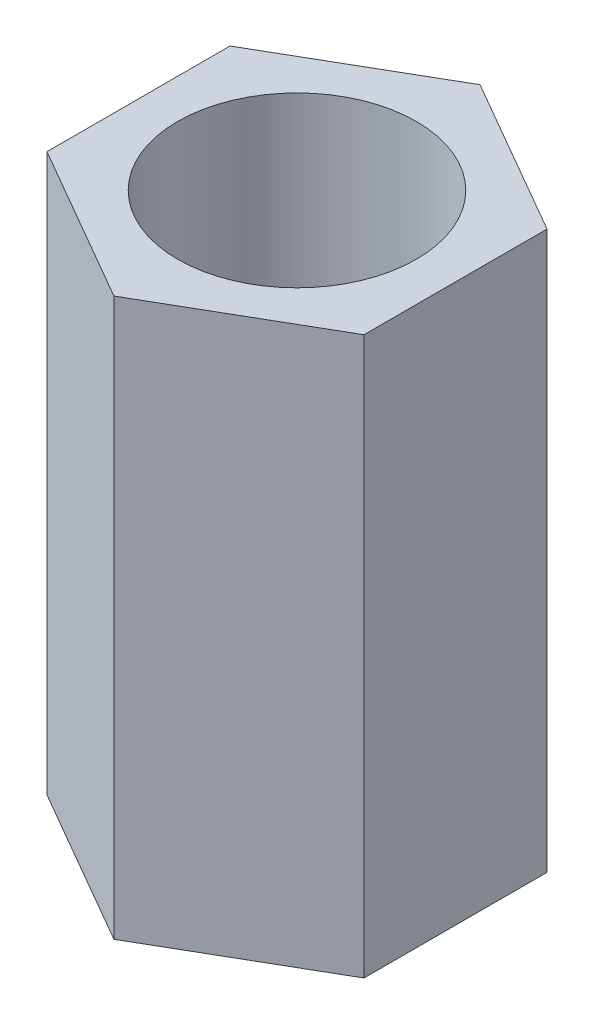
ISO-10303-21;
HEADER;
FILE_DESCRIPTION(('STEP AP214'),'2;1');
FILE_NAME('part.step','',(''),(''),'','','');
FILE_SCHEMA(('AUTOMOTIVE_DESIGN { 1 0 10303 214 1 1 1 1 }'));
ENDSEC;
DATA;
#1=APPLICATION_CONTEXT('core data for automotive mechanical design processes');
#2=APPLICATION_PROTOCOL_DEFINITION('international standard','automotive_design',2000,#1);
#3=PRODUCT_CONTEXT('',#1,'mechanical');
#4=PRODUCT('Part','Part','',(#3));
#5=PRODUCT_RELATED_PRODUCT_CATEGORY('part','',(#4));
#6=PRODUCT_DEFINITION_FORMATION('','',#4);
#7=PRODUCT_DEFINITION_CONTEXT('part definition',#1,'design');
#8=PRODUCT_DEFINITION('design','',#6,#7);
#9=PRODUCT_DEFINITION_SHAPE('','',#8);
#10=(LENGTH_UNIT() NAMED_UNIT(*) SI_UNIT(.MILLI.,.METRE.));
#11=(NAMED_UNIT(*) PLANE_ANGLE_UNIT() SI_UNIT($,.RADIAN.));
#12=(NAMED_UNIT(*) SI_UNIT($,.STERADIAN.) SOLID_ANGLE_UNIT());
#13=UNCERTAINTY_MEASURE_WITH_UNIT(LENGTH_MEASURE(1.E-05),#10,'distance_accuracy_value','');
#14=(GEOMETRIC_REPRESENTATION_CONTEXT(3) GLOBAL_UNCERTAINTY_ASSIGNED_CONTEXT((#13)) GLOBAL_UNIT_ASSIGNED_CONTEXT((#10,
#11,#12)) REPRESENTATION_CONTEXT('',''));
#15=CARTESIAN_POINT('',(0.,0.,0.));
#16=DIRECTION('',(0.,0.,1.));
#17=DIRECTION('',(1.,0.,0.));
#18=AXIS2_PLACEMENT_3D('',#15,#16,#17);
#19=CARTESIAN_POINT('',(0.,7.,0.));
#20=DIRECTION('',(0.,1.,0.));
#21=DIRECTION('',(0.,0.,1.));
#22=AXIS2_PLACEMENT_3D('',#19,#20,#21);
#23=PLANE('',#22);
#24=DIRECTION('',(0.,0.,-1.));
#25=VECTOR('',#24,1.);
#26=CARTESIAN_POINT('',(1.99185842870422,7.,1.14999999999998));
#27=LINE('',#26,#25);
#28=CARTESIAN_POINT('',(1.99185842870422,7.,1.14999999999998));
#29=VERTEX_POINT('',#28);
#30=CARTESIAN_POINT('',(1.9918584287042,7.,-1.15000000000002));
#31=VERTEX_POINT('',#30);
#32=EDGE_CURVE('E137',#29,#31,#27,.T.);
#33=ORIENTED_EDGE('',*,*,#32,.T.);
#34=DIRECTION('',(-0.866025403784443,0.,-0.499999999999992));
#35=VECTOR('',#34,1.);
#36=CARTESIAN_POINT('',(1.9918584287042,7.,-1.15000000000002));
#37=LINE('',#36,#35);
#38=CARTESIAN_POINT('',(0.,7.,-2.3));
#39=VERTEX_POINT('',#38);
#40=EDGE_CURVE('E95',#31,#39,#37,.T.);
#41=ORIENTED_EDGE('',*,*,#40,.T.);
#42=DIRECTION('',(-0.866025403784434,0.,0.500000000000008));
#43=VECTOR('',#42,1.);
#44=CARTESIAN_POINT('',(0.,7.,-2.3));
#45=LINE('',#44,#43);
#46=CARTESIAN_POINT('',(-1.99185842870422,7.,-1.14999999999998));
#47=VERTEX_POINT('',#46);
#48=EDGE_CURVE('E108',#39,#47,#45,.T.);
#49=ORIENTED_EDGE('',*,*,#48,.T.);
#50=DIRECTION('',(0.,0.,1.));
#51=VECTOR('',#50,1.);
#52=CARTESIAN_POINT('',(-1.99185842870422,7.,-1.14999999999998));
#53=LINE('',#52,#51);
#54=CARTESIAN_POINT('',(-1.9918584287042,7.,1.15000000000002));
#55=VERTEX_POINT('',#54);
#56=EDGE_CURVE('E102',#47,#55,#53,.T.);
#57=ORIENTED_EDGE('',*,*,#56,.T.);
#58=DIRECTION('',(0.866025403784443,0.,0.499999999999992));
#59=VECTOR('',#58,1.);
#60=CARTESIAN_POINT('',(-1.9918584287042,7.,1.15000000000002));
#61=LINE('',#60,#59);
#62=CARTESIAN_POINT('',(0.,7.,2.3));
#63=VERTEX_POINT('',#62);
#64=EDGE_CURVE('E106',#55,#63,#61,.T.);
#65=ORIENTED_EDGE('',*,*,#64,.T.);
#66=DIRECTION('',(0.866025403784434,0.,-0.500000000000008));
#67=VECTOR('',#66,1.);
#68=CARTESIAN_POINT('',(0.,7.,2.3));
#69=LINE('',#68,#67);
#70=EDGE_CURVE('E58',#63,#29,#69,.T.);
#71=ORIENTED_EDGE('',*,*,#70,.T.);
#72=EDGE_LOOP('',(#33,#41,#49,#57,#65,#71));
#73=FACE_BOUND('',#72,.T.);
#74=CARTESIAN_POINT('',(0.,7.,0.));
#75=DIRECTION('',(0.,1.,0.));
#76=DIRECTION('',(0.,0.,1.));
#77=AXIS2_PLACEMENT_3D('',#74,#75,#76);
#78=CIRCLE('',#77,1.5);
#79=CARTESIAN_POINT('',(0.,7.,1.5));
#80=VERTEX_POINT('',#79);
#81=EDGE_CURVE('E130',#80,#80,#78,.T.);
#82=ORIENTED_EDGE('',*,*,#81,.F.);
#83=EDGE_LOOP('',(#82));
#84=FACE_BOUND('',#83,.T.);
#85=ADVANCED_FACE('F41',(#73,#84),#23,.T.);
#86=CARTESIAN_POINT('',(0.,0.,0.));
#87=DIRECTION('',(0.,1.,0.));
#88=DIRECTION('',(0.,0.,1.));
#89=AXIS2_PLACEMENT_3D('',#86,#87,#88);
#90=PLANE('',#89);
#91=DIRECTION('',(0.,0.,-1.));
#92=VECTOR('',#91,1.);
#93=CARTESIAN_POINT('',(1.99185842870422,0.,1.14999999999998));
#94=LINE('',#93,#92);
#95=CARTESIAN_POINT('',(1.99185842870422,0.,1.14999999999998));
#96=VERTEX_POINT('',#95);
#97=CARTESIAN_POINT('',(1.9918584287042,0.,-1.15000000000002));
#98=VERTEX_POINT('',#97);
#99=EDGE_CURVE('E126',#96,#98,#94,.T.);
#100=ORIENTED_EDGE('',*,*,#99,.F.);
#101=DIRECTION('',(0.866025403784434,0.,-0.500000000000008));
#102=VECTOR('',#101,1.);
#103=CARTESIAN_POINT('',(0.,0.,2.3));
#104=LINE('',#103,#102);
#105=CARTESIAN_POINT('',(0.,0.,2.3));
#106=VERTEX_POINT('',#105);
#107=EDGE_CURVE('E87',#106,#96,#104,.T.);
#108=ORIENTED_EDGE('',*,*,#107,.F.);
#109=DIRECTION('',(0.866025403784443,0.,0.499999999999992));
#110=VECTOR('',#109,1.);
#111=CARTESIAN_POINT('',(-1.9918584287042,0.,1.15000000000002));
#112=LINE('',#111,#110);
#113=CARTESIAN_POINT('',(-1.9918584287042,0.,1.15000000000002));
#114=VERTEX_POINT('',#113);
#115=EDGE_CURVE('E81',#114,#106,#112,.T.);
#116=ORIENTED_EDGE('',*,*,#115,.F.);
#117=DIRECTION('',(0.,0.,1.));
#118=VECTOR('',#117,1.);
#119=CARTESIAN_POINT('',(-1.99185842870422,0.,-1.14999999999998));
#120=LINE('',#119,#118);
#121=CARTESIAN_POINT('',(-1.99185842870422,0.,-1.14999999999998));
#122=VERTEX_POINT('',#121);
#123=EDGE_CURVE('E116',#122,#114,#120,.T.);
#124=ORIENTED_EDGE('',*,*,#123,.F.);
#125=DIRECTION('',(-0.866025403784434,0.,0.500000000000008));
#126=VECTOR('',#125,1.);
#127=CARTESIAN_POINT('',(0.,0.,-2.3));
#128=LINE('',#127,#126);
#129=CARTESIAN_POINT('',(0.,0.,-2.3));
#130=VERTEX_POINT('',#129);
#131=EDGE_CURVE('E132',#130,#122,#128,.T.);
#132=ORIENTED_EDGE('',*,*,#131,.F.);
#133=DIRECTION('',(-0.866025403784443,0.,-0.499999999999992));
#134=VECTOR('',#133,1.);
#135=CARTESIAN_POINT('',(1.9918584287042,0.,-1.15000000000002));
#136=LINE('',#135,#134);
#137=EDGE_CURVE('E129',#98,#130,#136,.T.);
#138=ORIENTED_EDGE('',*,*,#137,.F.);
#139=EDGE_LOOP('',(#100,#108,#116,#124,#132,#138));
#140=FACE_BOUND('',#139,.T.);
#141=CARTESIAN_POINT('',(0.,0.,0.));
#142=DIRECTION('',(0.,1.,0.));
#143=DIRECTION('',(0.,0.,1.));
#144=AXIS2_PLACEMENT_3D('',#141,#142,#143);
#145=CIRCLE('',#144,1.5);
#146=CARTESIAN_POINT('',(0.,0.,1.5));
#147=VERTEX_POINT('',#146);
#148=EDGE_CURVE('E230',#147,#147,#145,.T.);
#149=ORIENTED_EDGE('',*,*,#148,.T.);
#150=EDGE_LOOP('',(#149));
#151=FACE_BOUND('',#150,.T.);
#152=ADVANCED_FACE('F146',(#140,#151),#90,.F.);
#153=CARTESIAN_POINT('',(1.99185842870422,7.,1.14999999999998));
#154=DIRECTION('',(-1.,0.,0.));
#155=DIRECTION('',(0.,0.,1.));
#156=AXIS2_PLACEMENT_3D('',#153,#154,#155);
#157=PLANE('',#156);
#158=ORIENTED_EDGE('',*,*,#99,.T.);
#159=DIRECTION('',(0.,-1.,0.));
#160=VECTOR('',#159,1.);
#161=CARTESIAN_POINT('',(1.9918584287042,7.,-1.15000000000002));
#162=LINE('',#161,#160);
#163=EDGE_CURVE('E11',#31,#98,#162,.T.);
#164=ORIENTED_EDGE('',*,*,#163,.F.);
#165=ORIENTED_EDGE('',*,*,#32,.F.);
#166=DIRECTION('',(0.,-1.,0.));
#167=VECTOR('',#166,1.);
#168=CARTESIAN_POINT('',(1.99185842870422,7.,1.14999999999998));
#169=LINE('',#168,#167);
#170=EDGE_CURVE('E122',#29,#96,#169,.T.);
#171=ORIENTED_EDGE('',*,*,#170,.T.);
#172=EDGE_LOOP('',(#158,#164,#165,#171));
#173=FACE_BOUND('',#172,.T.);
#174=ADVANCED_FACE('F43',(#173),#157,.F.);
#175=CARTESIAN_POINT('',(1.9918584287042,7.,-1.15000000000002));
#176=DIRECTION('',(-0.499999999999992,0.,0.866025403784443));
#177=DIRECTION('',(0.866025403784443,0.,0.499999999999992));
#178=AXIS2_PLACEMENT_3D('',#175,#176,#177);
#179=PLANE('',#178);
#180=ORIENTED_EDGE('',*,*,#137,.T.);
#181=DIRECTION('',(0.,-1.,0.));
#182=VECTOR('',#181,1.);
#183=CARTESIAN_POINT('',(0.,7.,-2.3));
#184=LINE('',#183,#182);
#185=EDGE_CURVE('E50',#39,#130,#184,.T.);
#186=ORIENTED_EDGE('',*,*,#185,.F.);
#187=ORIENTED_EDGE('',*,*,#40,.F.);
#188=ORIENTED_EDGE('',*,*,#163,.T.);
#189=EDGE_LOOP('',(#180,#186,#187,#188));
#190=FACE_BOUND('',#189,.T.);
#191=ADVANCED_FACE('F171',(#190),#179,.F.);
#192=CARTESIAN_POINT('',(0.,7.,-2.3));
#193=DIRECTION('',(0.500000000000008,0.,0.866025403784434));
#194=DIRECTION('',(0.866025403784434,0.,-0.500000000000008));
#195=AXIS2_PLACEMENT_3D('',#192,#193,#194);
#196=PLANE('',#195);
#197=ORIENTED_EDGE('',*,*,#131,.T.);
#198=DIRECTION('',(0.,-1.,0.));
#199=VECTOR('',#198,1.);
#200=CARTESIAN_POINT('',(-1.99185842870422,7.,-1.14999999999998));
#201=LINE('',#200,#199);
#202=EDGE_CURVE('E117',#47,#122,#201,.T.);
#203=ORIENTED_EDGE('',*,*,#202,.F.);
#204=ORIENTED_EDGE('',*,*,#48,.F.);
#205=ORIENTED_EDGE('',*,*,#185,.T.);
#206=EDGE_LOOP('',(#197,#203,#204,#205));
#207=FACE_BOUND('',#206,.T.);
#208=ADVANCED_FACE('F143',(#207),#196,.F.);
#209=CARTESIAN_POINT('',(-1.99185842870422,7.,-1.14999999999998));
#210=DIRECTION('',(1.,0.,0.));
#211=DIRECTION('',(0.,0.,-1.));
#212=AXIS2_PLACEMENT_3D('',#209,#210,#211);
#213=PLANE('',#212);
#214=ORIENTED_EDGE('',*,*,#123,.T.);
#215=DIRECTION('',(0.,-1.,0.));
#216=VECTOR('',#215,1.);
#217=CARTESIAN_POINT('',(-1.9918584287042,7.,1.15000000000002));
#218=LINE('',#217,#216);
#219=EDGE_CURVE('E113',#55,#114,#218,.T.);
#220=ORIENTED_EDGE('',*,*,#219,.F.);
#221=ORIENTED_EDGE('',*,*,#56,.F.);
#222=ORIENTED_EDGE('',*,*,#202,.T.);
#223=EDGE_LOOP('',(#214,#220,#221,#222));
#224=FACE_BOUND('',#223,.T.);
#225=ADVANCED_FACE('F114',(#224),#213,.F.);
#226=CARTESIAN_POINT('',(-1.9918584287042,7.,1.15000000000002));
#227=DIRECTION('',(0.499999999999992,0.,-0.866025403784443));
#228=DIRECTION('',(-0.866025403784443,0.,-0.499999999999992));
#229=AXIS2_PLACEMENT_3D('',#226,#227,#228);
#230=PLANE('',#229);
#231=ORIENTED_EDGE('',*,*,#115,.T.);
#232=DIRECTION('',(0.,-1.,0.));
#233=VECTOR('',#232,1.);
#234=CARTESIAN_POINT('',(0.,7.,2.3));
#235=LINE('',#234,#233);
#236=EDGE_CURVE('E118',#63,#106,#235,.T.);
#237=ORIENTED_EDGE('',*,*,#236,.F.);
#238=ORIENTED_EDGE('',*,*,#64,.F.);
#239=ORIENTED_EDGE('',*,*,#219,.T.);
#240=EDGE_LOOP('',(#231,#237,#238,#239));
#241=FACE_BOUND('',#240,.T.);
#242=ADVANCED_FACE('F120',(#241),#230,.F.);
#243=CARTESIAN_POINT('',(0.,7.,2.3));
#244=DIRECTION('',(-0.500000000000008,0.,-0.866025403784434));
#245=DIRECTION('',(-0.866025403784434,0.,0.500000000000008));
#246=AXIS2_PLACEMENT_3D('',#243,#244,#245);
#247=PLANE('',#246);
#248=ORIENTED_EDGE('',*,*,#107,.T.);
#249=ORIENTED_EDGE('',*,*,#170,.F.);
#250=ORIENTED_EDGE('',*,*,#70,.F.);
#251=ORIENTED_EDGE('',*,*,#236,.T.);
#252=EDGE_LOOP('',(#248,#249,#250,#251));
#253=FACE_BOUND('',#252,.T.);
#254=ADVANCED_FACE('F151',(#253),#247,.F.);
#255=CARTESIAN_POINT('',(0.,7.,0.));
#256=DIRECTION('',(0.,-1.,0.));
#257=DIRECTION('',(0.,0.,-1.));
#258=AXIS2_PLACEMENT_3D('',#255,#256,#257);
#259=CYLINDRICAL_SURFACE('',#258,1.5);
#260=ORIENTED_EDGE('',*,*,#81,.T.);
#261=EDGE_LOOP('',(#260));
#262=FACE_BOUND('',#261,.T.);
#263=ORIENTED_EDGE('',*,*,#148,.F.);
#264=EDGE_LOOP('',(#263));
#265=FACE_BOUND('',#264,.T.);
#266=ADVANCED_FACE('F153',(#262,#265),#259,.F.);
#267=CLOSED_SHELL('',(#85,#152,#174,#191,#208,#225,#242,#254,#266));
#268=MANIFOLD_SOLID_BREP('B2',#267);
#269=ADVANCED_BREP_SHAPE_REPRESENTATION('',(#18,#268),#14);
#270=SHAPE_DEFINITION_REPRESENTATION(#9,#269);
ENDSEC;
END-ISO-10303-21;
